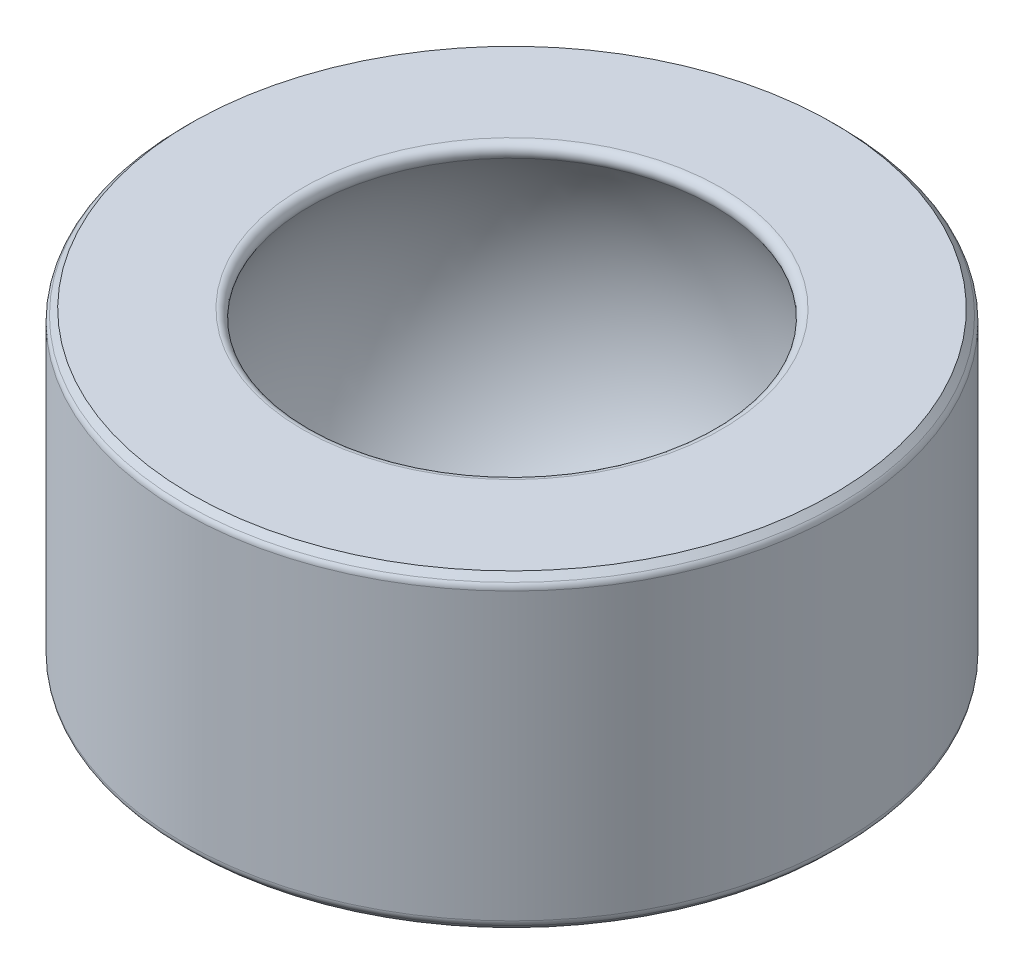
ISO-10303-21;
HEADER;
FILE_DESCRIPTION(('STEP AP214'),'2;1');
FILE_NAME('part.step','',(''),(''),'','','');
FILE_SCHEMA(('AUTOMOTIVE_DESIGN { 1 0 10303 214 1 1 1 1 }'));
ENDSEC;
DATA;
#1=APPLICATION_CONTEXT('core data for automotive mechanical design processes');
#2=APPLICATION_PROTOCOL_DEFINITION('international standard','automotive_design',2000,#1);
#3=PRODUCT_CONTEXT('',#1,'mechanical');
#4=PRODUCT('Part','Part','',(#3));
#5=PRODUCT_RELATED_PRODUCT_CATEGORY('part','',(#4));
#6=PRODUCT_DEFINITION_FORMATION('','',#4);
#7=PRODUCT_DEFINITION_CONTEXT('part definition',#1,'design');
#8=PRODUCT_DEFINITION('design','',#6,#7);
#9=PRODUCT_DEFINITION_SHAPE('','',#8);
#10=(LENGTH_UNIT() NAMED_UNIT(*) SI_UNIT(.MILLI.,.METRE.));
#11=(NAMED_UNIT(*) PLANE_ANGLE_UNIT() SI_UNIT($,.RADIAN.));
#12=(NAMED_UNIT(*) SI_UNIT($,.STERADIAN.) SOLID_ANGLE_UNIT());
#13=UNCERTAINTY_MEASURE_WITH_UNIT(LENGTH_MEASURE(1.E-05),#10,'distance_accuracy_value','');
#14=(GEOMETRIC_REPRESENTATION_CONTEXT(3) GLOBAL_UNCERTAINTY_ASSIGNED_CONTEXT((#13)) GLOBAL_UNIT_ASSIGNED_CONTEXT((#10,
#11,#12)) REPRESENTATION_CONTEXT('',''));
#15=CARTESIAN_POINT('',(0.,0.,0.));
#16=DIRECTION('',(0.,0.,1.));
#17=DIRECTION('',(1.,0.,0.));
#18=AXIS2_PLACEMENT_3D('',#15,#16,#17);
#19=CARTESIAN_POINT('',(0.,-1.875,0.));
#20=DIRECTION('',(0.,1.,0.));
#21=DIRECTION('',(0.,0.,1.));
#22=AXIS2_PLACEMENT_3D('',#19,#20,#21);
#23=CYLINDRICAL_SURFACE('',#22,4.);
#24=CARTESIAN_POINT('',(0.,-1.73357864376269,0.));
#25=DIRECTION('',(0.,-1.,0.));
#26=DIRECTION('',(0.,0.,-1.));
#27=AXIS2_PLACEMENT_3D('',#24,#25,#26);
#28=CIRCLE('',#27,4.);
#29=CARTESIAN_POINT('',(0.,-1.73357864376269,-4.));
#30=VERTEX_POINT('',#29);
#31=EDGE_CURVE('E65',#30,#30,#28,.F.);
#32=ORIENTED_EDGE('',*,*,#31,.T.);
#33=EDGE_LOOP('',(#32));
#34=FACE_BOUND('',#33,.T.);
#35=CARTESIAN_POINT('',(0.,1.73357864376269,0.));
#36=DIRECTION('',(0.,1.,0.));
#37=DIRECTION('',(0.,0.,1.));
#38=AXIS2_PLACEMENT_3D('',#35,#36,#37);
#39=CIRCLE('',#38,4.);
#40=CARTESIAN_POINT('',(0.,1.73357864376269,4.));
#41=VERTEX_POINT('',#40);
#42=EDGE_CURVE('E68',#41,#41,#39,.F.);
#43=ORIENTED_EDGE('',*,*,#42,.T.);
#44=EDGE_LOOP('',(#43));
#45=FACE_BOUND('',#44,.T.);
#46=ADVANCED_FACE('F39',(#34,#45),#23,.T.);
#47=CARTESIAN_POINT('',(0.,-1.875,0.));
#48=DIRECTION('',(0.,1.,0.));
#49=DIRECTION('',(0.,0.,1.));
#50=AXIS2_PLACEMENT_3D('',#47,#48,#49);
#51=PLANE('',#50);
#52=CARTESIAN_POINT('',(0.,-1.875,0.));
#53=DIRECTION('',(0.,1.,0.));
#54=DIRECTION('',(0.,0.,1.));
#55=AXIS2_PLACEMENT_3D('',#52,#53,#54);
#56=CIRCLE('',#55,2.54153005097323);
#57=CARTESIAN_POINT('',(0.,-1.875,2.54153005097323));
#58=VERTEX_POINT('',#57);
#59=EDGE_CURVE('E54',#58,#58,#56,.T.);
#60=ORIENTED_EDGE('',*,*,#59,.T.);
#61=EDGE_LOOP('',(#60));
#62=FACE_BOUND('',#61,.T.);
#63=CARTESIAN_POINT('',(0.,-1.875,0.));
#64=DIRECTION('',(0.,1.,0.));
#65=DIRECTION('',(0.,0.,1.));
#66=AXIS2_PLACEMENT_3D('',#63,#64,#65);
#67=CIRCLE('',#66,3.9);
#68=CARTESIAN_POINT('',(0.,-1.875,3.9));
#69=VERTEX_POINT('',#68);
#70=EDGE_CURVE('E71',#69,#69,#67,.F.);
#71=ORIENTED_EDGE('',*,*,#70,.T.);
#72=EDGE_LOOP('',(#71));
#73=FACE_BOUND('',#72,.T.);
#74=ADVANCED_FACE('F97',(#62,#73),#51,.F.);
#75=CARTESIAN_POINT('',(0.,1.875,0.));
#76=DIRECTION('',(0.,1.,0.));
#77=DIRECTION('',(0.,0.,1.));
#78=AXIS2_PLACEMENT_3D('',#75,#76,#77);
#79=PLANE('',#78);
#80=CARTESIAN_POINT('',(0.,1.875,0.));
#81=DIRECTION('',(0.,1.,0.));
#82=DIRECTION('',(0.,0.,1.));
#83=AXIS2_PLACEMENT_3D('',#80,#81,#82);
#84=CIRCLE('',#83,2.54153005097323);
#85=CARTESIAN_POINT('',(0.,1.875,2.54153005097323));
#86=VERTEX_POINT('',#85);
#87=EDGE_CURVE('E10',#86,#86,#84,.F.);
#88=ORIENTED_EDGE('',*,*,#87,.T.);
#89=EDGE_LOOP('',(#88));
#90=FACE_BOUND('',#89,.T.);
#91=CARTESIAN_POINT('',(0.,1.875,0.));
#92=DIRECTION('',(0.,1.,0.));
#93=DIRECTION('',(0.,0.,1.));
#94=AXIS2_PLACEMENT_3D('',#91,#92,#93);
#95=CIRCLE('',#94,3.9);
#96=CARTESIAN_POINT('',(0.,1.875,3.9));
#97=VERTEX_POINT('',#96);
#98=EDGE_CURVE('E74',#97,#97,#95,.T.);
#99=ORIENTED_EDGE('',*,*,#98,.T.);
#100=EDGE_LOOP('',(#99));
#101=FACE_BOUND('',#100,.T.);
#102=ADVANCED_FACE('F78',(#90,#101),#79,.T.);
#103=CARTESIAN_POINT('',(0.,0.,0.));
#104=DIRECTION('',(0.,0.,-1.));
#105=DIRECTION('',(1.,0.,0.));
#106=AXIS2_PLACEMENT_3D('',#103,#104,#105);
#107=SPHERICAL_SURFACE('',#106,3.);
#108=CARTESIAN_POINT('',(0.,0.,0.));
#109=DIRECTION('',(0.,1.,0.));
#110=DIRECTION('',(0.,0.,1.));
#111=AXIS2_PLACEMENT_3D('',#108,#109,#110);
#112=SPHERICAL_SURFACE('',#111,3.);
#113=CARTESIAN_POINT('',(0.,-1.71774193548387,0.));
#114=DIRECTION('',(0.,1.,0.));
#115=DIRECTION('',(0.,0.,1.));
#116=AXIS2_PLACEMENT_3D('',#113,#114,#115);
#117=CIRCLE('',#116,2.45954521061926);
#118=CARTESIAN_POINT('',(0.,-1.71774193548387,2.45954521061926));
#119=VERTEX_POINT('',#118);
#120=EDGE_CURVE('E46',#119,#119,#117,.F.);
#121=ORIENTED_EDGE('',*,*,#120,.T.);
#122=EDGE_LOOP('',(#121));
#123=FACE_BOUND('',#122,.T.);
#124=CARTESIAN_POINT('',(0.,1.71774193548387,0.));
#125=DIRECTION('',(0.,-1.,0.));
#126=DIRECTION('',(0.,0.,-1.));
#127=AXIS2_PLACEMENT_3D('',#124,#125,#126);
#128=CIRCLE('',#127,2.45954521061926);
#129=CARTESIAN_POINT('',(0.,1.71774193548387,-2.45954521061926));
#130=VERTEX_POINT('',#129);
#131=EDGE_CURVE('E50',#130,#130,#128,.F.);
#132=ORIENTED_EDGE('',*,*,#131,.T.);
#133=EDGE_LOOP('',(#132));
#134=FACE_BOUND('',#133,.T.);
#135=ADVANCED_FACE('F83',(#123,#134),#112,.F.);
#136=CARTESIAN_POINT('',(0.,1.875,0.));
#137=DIRECTION('',(0.,-1.,0.));
#138=DIRECTION('',(0.,0.,-1.));
#139=AXIS2_PLACEMENT_3D('',#136,#137,#138);
#140=CONICAL_SURFACE('',#139,3.9,0.785398163397448);
#141=CARTESIAN_POINT('',(0.,1.80428932188135,0.));
#142=DIRECTION('',(0.,1.,0.));
#143=DIRECTION('',(0.,0.,1.));
#144=AXIS2_PLACEMENT_3D('',#141,#142,#143);
#145=CIRCLE('',#144,3.97071067811865);
#146=CARTESIAN_POINT('',(0.,1.80428932188135,3.97071067811865));
#147=VERTEX_POINT('',#146);
#148=EDGE_CURVE('E59',#147,#147,#145,.T.);
#149=ORIENTED_EDGE('',*,*,#148,.T.);
#150=EDGE_LOOP('',(#149));
#151=FACE_BOUND('',#150,.T.);
#152=ORIENTED_EDGE('',*,*,#98,.F.);
#153=EDGE_LOOP('',(#152));
#154=FACE_BOUND('',#153,.T.);
#155=ADVANCED_FACE('F80',(#151,#154),#140,.T.);
#156=CARTESIAN_POINT('',(0.,-1.775,0.));
#157=DIRECTION('',(0.,1.,0.));
#158=DIRECTION('',(0.,0.,1.));
#159=AXIS2_PLACEMENT_3D('',#156,#157,#158);
#160=CONICAL_SURFACE('',#159,4.,0.785398163397453);
#161=CARTESIAN_POINT('',(0.,-1.80428932188135,0.));
#162=DIRECTION('',(0.,-1.,0.));
#163=DIRECTION('',(0.,0.,-1.));
#164=AXIS2_PLACEMENT_3D('',#161,#162,#163);
#165=CIRCLE('',#164,3.97071067811865);
#166=CARTESIAN_POINT('',(0.,-1.80428932188135,-3.97071067811865));
#167=VERTEX_POINT('',#166);
#168=EDGE_CURVE('E62',#167,#167,#165,.T.);
#169=ORIENTED_EDGE('',*,*,#168,.T.);
#170=EDGE_LOOP('',(#169));
#171=FACE_BOUND('',#170,.T.);
#172=ORIENTED_EDGE('',*,*,#70,.F.);
#173=EDGE_LOOP('',(#172));
#174=FACE_BOUND('',#173,.T.);
#175=ADVANCED_FACE('F82',(#171,#174),#160,.T.);
#176=CARTESIAN_POINT('',(0.,-1.73357864376269,0.));
#177=DIRECTION('',(0.,-1.,0.));
#178=DIRECTION('',(0.,0.,-1.));
#179=AXIS2_PLACEMENT_3D('',#176,#177,#178);
#180=TOROIDAL_SURFACE('',#179,3.9,0.1);
#181=ORIENTED_EDGE('',*,*,#168,.F.);
#182=EDGE_LOOP('',(#181));
#183=FACE_BOUND('',#182,.T.);
#184=ORIENTED_EDGE('',*,*,#31,.F.);
#185=EDGE_LOOP('',(#184));
#186=FACE_BOUND('',#185,.T.);
#187=ADVANCED_FACE('F90',(#183,#186),#180,.T.);
#188=CARTESIAN_POINT('',(0.,1.73357864376269,0.));
#189=DIRECTION('',(0.,1.,0.));
#190=DIRECTION('',(0.,0.,1.));
#191=AXIS2_PLACEMENT_3D('',#188,#189,#190);
#192=TOROIDAL_SURFACE('',#191,3.9,0.1);
#193=ORIENTED_EDGE('',*,*,#148,.F.);
#194=EDGE_LOOP('',(#193));
#195=FACE_BOUND('',#194,.T.);
#196=ORIENTED_EDGE('',*,*,#42,.F.);
#197=EDGE_LOOP('',(#196));
#198=FACE_BOUND('',#197,.T.);
#199=ADVANCED_FACE('F124',(#195,#198),#192,.T.);
#200=CARTESIAN_POINT('',(0.,-1.775,0.));
#201=DIRECTION('',(0.,1.,0.));
#202=DIRECTION('',(0.,0.,1.));
#203=AXIS2_PLACEMENT_3D('',#200,#201,#202);
#204=TOROIDAL_SURFACE('',#203,2.54153005097323,0.1);
#205=ORIENTED_EDGE('',*,*,#120,.F.);
#206=EDGE_LOOP('',(#205));
#207=FACE_BOUND('',#206,.T.);
#208=ORIENTED_EDGE('',*,*,#59,.F.);
#209=EDGE_LOOP('',(#208));
#210=FACE_BOUND('',#209,.T.);
#211=ADVANCED_FACE('F119',(#207,#210),#204,.T.);
#212=CARTESIAN_POINT('',(0.,1.775,0.));
#213=DIRECTION('',(0.,1.,0.));
#214=DIRECTION('',(0.,0.,1.));
#215=AXIS2_PLACEMENT_3D('',#212,#213,#214);
#216=TOROIDAL_SURFACE('',#215,2.54153005097323,0.1);
#217=ORIENTED_EDGE('',*,*,#87,.F.);
#218=EDGE_LOOP('',(#217));
#219=FACE_BOUND('',#218,.T.);
#220=ORIENTED_EDGE('',*,*,#131,.F.);
#221=EDGE_LOOP('',(#220));
#222=FACE_BOUND('',#221,.T.);
#223=ADVANCED_FACE('F41',(#219,#222),#216,.T.);
#224=CLOSED_SHELL('',(#46,#74,#102,#135,#155,#175,#187,#199,#211,#223));
#225=MANIFOLD_SOLID_BREP('B2',#224);
#226=ADVANCED_BREP_SHAPE_REPRESENTATION('',(#18,#225),#14);
#227=SHAPE_DEFINITION_REPRESENTATION(#9,#226);
ENDSEC;
END-ISO-10303-21;
